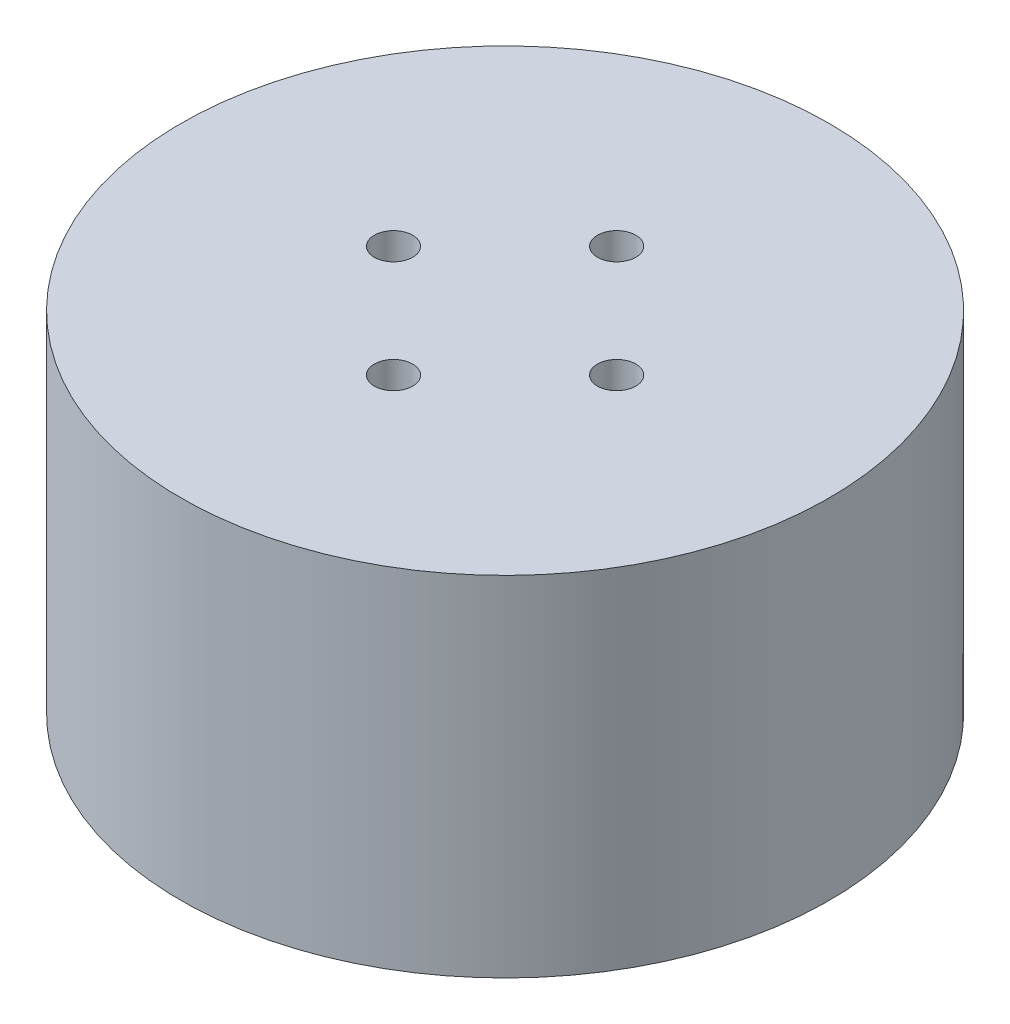
ISO-10303-21;
HEADER;
FILE_DESCRIPTION(('STEP AP214'),'2;1');
FILE_NAME('part.step','',(''),(''),'','','');
FILE_SCHEMA(('AUTOMOTIVE_DESIGN { 1 0 10303 214 1 1 1 1 }'));
ENDSEC;
DATA;
#1=APPLICATION_CONTEXT('core data for automotive mechanical design processes');
#2=APPLICATION_PROTOCOL_DEFINITION('international standard','automotive_design',2000,#1);
#3=PRODUCT_CONTEXT('',#1,'mechanical');
#4=PRODUCT('Part','Part','',(#3));
#5=PRODUCT_RELATED_PRODUCT_CATEGORY('part','',(#4));
#6=PRODUCT_DEFINITION_FORMATION('','',#4);
#7=PRODUCT_DEFINITION_CONTEXT('part definition',#1,'design');
#8=PRODUCT_DEFINITION('design','',#6,#7);
#9=PRODUCT_DEFINITION_SHAPE('','',#8);
#10=(LENGTH_UNIT() NAMED_UNIT(*) SI_UNIT(.MILLI.,.METRE.));
#11=(NAMED_UNIT(*) PLANE_ANGLE_UNIT() SI_UNIT($,.RADIAN.));
#12=(NAMED_UNIT(*) SI_UNIT($,.STERADIAN.) SOLID_ANGLE_UNIT());
#13=UNCERTAINTY_MEASURE_WITH_UNIT(LENGTH_MEASURE(1.E-05),#10,'distance_accuracy_value','');
#14=(GEOMETRIC_REPRESENTATION_CONTEXT(3) GLOBAL_UNCERTAINTY_ASSIGNED_CONTEXT((#13)) GLOBAL_UNIT_ASSIGNED_CONTEXT((#10,
#11,#12)) REPRESENTATION_CONTEXT('',''));
#15=CARTESIAN_POINT('',(0.,0.,0.));
#16=DIRECTION('',(0.,0.,1.));
#17=DIRECTION('',(1.,0.,0.));
#18=AXIS2_PLACEMENT_3D('',#15,#16,#17);
#19=CARTESIAN_POINT('',(0.,50.,0.));
#20=DIRECTION('',(0.,1.,0.));
#21=DIRECTION('',(0.,0.,1.));
#22=AXIS2_PLACEMENT_3D('',#19,#20,#21);
#23=PLANE('',#22);
#24=CARTESIAN_POINT('',(-16.,50.,0.));
#25=DIRECTION('',(0.,1.,0.));
#26=DIRECTION('',(0.,0.,1.));
#27=AXIS2_PLACEMENT_3D('',#24,#25,#26);
#28=CIRCLE('',#27,2.75);
#29=CARTESIAN_POINT('',(-16.,50.,2.75));
#30=VERTEX_POINT('',#29);
#31=EDGE_CURVE('E58',#30,#30,#28,.T.);
#32=ORIENTED_EDGE('',*,*,#31,.F.);
#33=EDGE_LOOP('',(#32));
#34=FACE_BOUND('',#33,.T.);
#35=CARTESIAN_POINT('',(0.,50.,16.));
#36=DIRECTION('',(0.,1.,0.));
#37=DIRECTION('',(0.,0.,1.));
#38=AXIS2_PLACEMENT_3D('',#35,#36,#37);
#39=CIRCLE('',#38,2.75);
#40=CARTESIAN_POINT('',(0.,50.,18.75));
#41=VERTEX_POINT('',#40);
#42=EDGE_CURVE('E75',#41,#41,#39,.T.);
#43=ORIENTED_EDGE('',*,*,#42,.F.);
#44=EDGE_LOOP('',(#43));
#45=FACE_BOUND('',#44,.T.);
#46=CARTESIAN_POINT('',(16.,50.,0.));
#47=DIRECTION('',(0.,1.,0.));
#48=DIRECTION('',(0.,0.,1.));
#49=AXIS2_PLACEMENT_3D('',#46,#47,#48);
#50=CIRCLE('',#49,2.75);
#51=CARTESIAN_POINT('',(16.,50.,2.75));
#52=VERTEX_POINT('',#51);
#53=EDGE_CURVE('E117',#52,#52,#50,.T.);
#54=ORIENTED_EDGE('',*,*,#53,.F.);
#55=EDGE_LOOP('',(#54));
#56=FACE_BOUND('',#55,.T.);
#57=CARTESIAN_POINT('',(0.,50.,-16.));
#58=DIRECTION('',(0.,1.,0.));
#59=DIRECTION('',(0.,0.,1.));
#60=AXIS2_PLACEMENT_3D('',#57,#58,#59);
#61=CIRCLE('',#60,2.75);
#62=CARTESIAN_POINT('',(0.,50.,-13.25));
#63=VERTEX_POINT('',#62);
#64=EDGE_CURVE('E62',#63,#63,#61,.T.);
#65=ORIENTED_EDGE('',*,*,#64,.F.);
#66=EDGE_LOOP('',(#65));
#67=FACE_BOUND('',#66,.T.);
#68=CARTESIAN_POINT('',(0.,50.,0.));
#69=DIRECTION('',(0.,-1.,0.));
#70=DIRECTION('',(0.,0.,-1.));
#71=AXIS2_PLACEMENT_3D('',#68,#69,#70);
#72=CIRCLE('',#71,46.5);
#73=CARTESIAN_POINT('',(0.,50.,-46.5));
#74=VERTEX_POINT('',#73);
#75=EDGE_CURVE('E123',#74,#74,#72,.T.);
#76=ORIENTED_EDGE('',*,*,#75,.F.);
#77=EDGE_LOOP('',(#76));
#78=FACE_BOUND('',#77,.T.);
#79=ADVANCED_FACE('F35',(#34,#45,#56,#67,#78),#23,.T.);
#80=CARTESIAN_POINT('',(0.,0.,0.));
#81=DIRECTION('',(0.,1.,0.));
#82=DIRECTION('',(0.,0.,1.));
#83=AXIS2_PLACEMENT_3D('',#80,#81,#82);
#84=PLANE('',#83);
#85=CARTESIAN_POINT('',(0.,0.,0.));
#86=DIRECTION('',(0.,-1.,0.));
#87=DIRECTION('',(0.,0.,-1.));
#88=AXIS2_PLACEMENT_3D('',#85,#86,#87);
#89=CIRCLE('',#88,26.);
#90=CARTESIAN_POINT('',(0.,0.,-26.));
#91=VERTEX_POINT('',#90);
#92=EDGE_CURVE('E43',#91,#91,#89,.T.);
#93=ORIENTED_EDGE('',*,*,#92,.F.);
#94=EDGE_LOOP('',(#93));
#95=FACE_BOUND('',#94,.T.);
#96=CARTESIAN_POINT('',(0.,0.,0.));
#97=DIRECTION('',(0.,-1.,0.));
#98=DIRECTION('',(0.,0.,-1.));
#99=AXIS2_PLACEMENT_3D('',#96,#97,#98);
#100=CIRCLE('',#99,46.5);
#101=CARTESIAN_POINT('',(0.,0.,-46.5));
#102=VERTEX_POINT('',#101);
#103=EDGE_CURVE('E125',#102,#102,#100,.T.);
#104=ORIENTED_EDGE('',*,*,#103,.T.);
#105=EDGE_LOOP('',(#104));
#106=FACE_BOUND('',#105,.T.);
#107=ADVANCED_FACE('F37',(#95,#106),#84,.F.);
#108=CARTESIAN_POINT('',(0.,20.,0.));
#109=DIRECTION('',(0.,-1.,0.));
#110=DIRECTION('',(0.,0.,-1.));
#111=AXIS2_PLACEMENT_3D('',#108,#109,#110);
#112=CYLINDRICAL_SURFACE('',#111,26.);
#113=CARTESIAN_POINT('',(0.,20.,0.));
#114=DIRECTION('',(0.,-1.,0.));
#115=DIRECTION('',(0.,0.,-1.));
#116=AXIS2_PLACEMENT_3D('',#113,#114,#115);
#117=CIRCLE('',#116,26.);
#118=CARTESIAN_POINT('',(0.,20.,-26.));
#119=VERTEX_POINT('',#118);
#120=EDGE_CURVE('E10',#119,#119,#117,.T.);
#121=ORIENTED_EDGE('',*,*,#120,.F.);
#122=EDGE_LOOP('',(#121));
#123=FACE_BOUND('',#122,.T.);
#124=ORIENTED_EDGE('',*,*,#92,.T.);
#125=EDGE_LOOP('',(#124));
#126=FACE_BOUND('',#125,.T.);
#127=ADVANCED_FACE('F91',(#123,#126),#112,.F.);
#128=CARTESIAN_POINT('',(0.,20.,0.));
#129=DIRECTION('',(0.,-1.,0.));
#130=DIRECTION('',(0.,0.,-1.));
#131=AXIS2_PLACEMENT_3D('',#128,#129,#130);
#132=PLANE('',#131);
#133=CARTESIAN_POINT('',(0.,20.,-16.));
#134=DIRECTION('',(0.,-1.,0.));
#135=DIRECTION('',(0.,0.,-1.));
#136=AXIS2_PLACEMENT_3D('',#133,#134,#135);
#137=CIRCLE('',#136,2.75);
#138=CARTESIAN_POINT('',(0.,20.,-18.75));
#139=VERTEX_POINT('',#138);
#140=EDGE_CURVE('E39',#139,#139,#137,.T.);
#141=ORIENTED_EDGE('',*,*,#140,.F.);
#142=EDGE_LOOP('',(#141));
#143=FACE_BOUND('',#142,.T.);
#144=CARTESIAN_POINT('',(16.,20.,0.));
#145=DIRECTION('',(0.,-1.,0.));
#146=DIRECTION('',(0.,0.,-1.));
#147=AXIS2_PLACEMENT_3D('',#144,#145,#146);
#148=CIRCLE('',#147,2.75);
#149=CARTESIAN_POINT('',(16.,20.,-2.75));
#150=VERTEX_POINT('',#149);
#151=EDGE_CURVE('E61',#150,#150,#148,.T.);
#152=ORIENTED_EDGE('',*,*,#151,.F.);
#153=EDGE_LOOP('',(#152));
#154=FACE_BOUND('',#153,.T.);
#155=CARTESIAN_POINT('',(0.,20.,16.));
#156=DIRECTION('',(0.,-1.,0.));
#157=DIRECTION('',(0.,0.,-1.));
#158=AXIS2_PLACEMENT_3D('',#155,#156,#157);
#159=CIRCLE('',#158,2.75);
#160=CARTESIAN_POINT('',(0.,20.,13.25));
#161=VERTEX_POINT('',#160);
#162=EDGE_CURVE('E59',#161,#161,#159,.T.);
#163=ORIENTED_EDGE('',*,*,#162,.F.);
#164=EDGE_LOOP('',(#163));
#165=FACE_BOUND('',#164,.T.);
#166=CARTESIAN_POINT('',(-16.,20.,0.));
#167=DIRECTION('',(0.,-1.,0.));
#168=DIRECTION('',(0.,0.,-1.));
#169=AXIS2_PLACEMENT_3D('',#166,#167,#168);
#170=CIRCLE('',#169,2.75);
#171=CARTESIAN_POINT('',(-16.,20.,-2.75));
#172=VERTEX_POINT('',#171);
#173=EDGE_CURVE('E54',#172,#172,#170,.T.);
#174=ORIENTED_EDGE('',*,*,#173,.F.);
#175=EDGE_LOOP('',(#174));
#176=FACE_BOUND('',#175,.T.);
#177=CARTESIAN_POINT('',(0.,20.,0.));
#178=DIRECTION('',(0.,-1.,0.));
#179=DIRECTION('',(0.,0.,-1.));
#180=AXIS2_PLACEMENT_3D('',#177,#178,#179);
#181=CIRCLE('',#180,11.);
#182=CARTESIAN_POINT('',(0.,20.,-11.));
#183=VERTEX_POINT('',#182);
#184=EDGE_CURVE('E51',#183,#183,#181,.T.);
#185=ORIENTED_EDGE('',*,*,#184,.F.);
#186=EDGE_LOOP('',(#185));
#187=FACE_BOUND('',#186,.T.);
#188=ORIENTED_EDGE('',*,*,#120,.T.);
#189=EDGE_LOOP('',(#188));
#190=FACE_BOUND('',#189,.T.);
#191=ADVANCED_FACE('F89',(#143,#154,#165,#176,#187,#190),#132,.T.);
#192=CARTESIAN_POINT('',(0.,27.5,0.));
#193=DIRECTION('',(0.,-1.,0.));
#194=DIRECTION('',(0.,0.,-1.));
#195=AXIS2_PLACEMENT_3D('',#192,#193,#194);
#196=CYLINDRICAL_SURFACE('',#195,11.);
#197=CARTESIAN_POINT('',(0.,27.5,0.));
#198=DIRECTION('',(0.,-1.,0.));
#199=DIRECTION('',(0.,0.,-1.));
#200=AXIS2_PLACEMENT_3D('',#197,#198,#199);
#201=CIRCLE('',#200,11.);
#202=CARTESIAN_POINT('',(0.,27.5,-11.));
#203=VERTEX_POINT('',#202);
#204=EDGE_CURVE('E48',#203,#203,#201,.T.);
#205=ORIENTED_EDGE('',*,*,#204,.F.);
#206=EDGE_LOOP('',(#205));
#207=FACE_BOUND('',#206,.T.);
#208=ORIENTED_EDGE('',*,*,#184,.T.);
#209=EDGE_LOOP('',(#208));
#210=FACE_BOUND('',#209,.T.);
#211=ADVANCED_FACE('F87',(#207,#210),#196,.F.);
#212=CARTESIAN_POINT('',(0.,27.5,0.));
#213=DIRECTION('',(0.,-1.,0.));
#214=DIRECTION('',(0.,0.,-1.));
#215=AXIS2_PLACEMENT_3D('',#212,#213,#214);
#216=PLANE('',#215);
#217=CARTESIAN_POINT('',(0.,27.5,0.));
#218=DIRECTION('',(0.,-1.,0.));
#219=DIRECTION('',(0.,0.,-1.));
#220=AXIS2_PLACEMENT_3D('',#217,#218,#219);
#221=CIRCLE('',#220,5.);
#222=CARTESIAN_POINT('',(0.,27.5,-5.));
#223=VERTEX_POINT('',#222);
#224=EDGE_CURVE('E57',#223,#223,#221,.T.);
#225=ORIENTED_EDGE('',*,*,#224,.F.);
#226=EDGE_LOOP('',(#225));
#227=FACE_BOUND('',#226,.T.);
#228=ORIENTED_EDGE('',*,*,#204,.T.);
#229=EDGE_LOOP('',(#228));
#230=FACE_BOUND('',#229,.T.);
#231=ADVANCED_FACE('F98',(#227,#230),#216,.T.);
#232=CARTESIAN_POINT('',(0.,41.,0.));
#233=DIRECTION('',(0.,-1.,0.));
#234=DIRECTION('',(0.,0.,-1.));
#235=AXIS2_PLACEMENT_3D('',#232,#233,#234);
#236=CYLINDRICAL_SURFACE('',#235,5.);
#237=CARTESIAN_POINT('',(0.,41.,0.));
#238=DIRECTION('',(0.,-1.,0.));
#239=DIRECTION('',(0.,0.,-1.));
#240=AXIS2_PLACEMENT_3D('',#237,#238,#239);
#241=CIRCLE('',#240,5.);
#242=CARTESIAN_POINT('',(0.,41.,-5.));
#243=VERTEX_POINT('',#242);
#244=EDGE_CURVE('E77',#243,#243,#241,.T.);
#245=ORIENTED_EDGE('',*,*,#244,.F.);
#246=EDGE_LOOP('',(#245));
#247=FACE_BOUND('',#246,.T.);
#248=ORIENTED_EDGE('',*,*,#224,.T.);
#249=EDGE_LOOP('',(#248));
#250=FACE_BOUND('',#249,.T.);
#251=ADVANCED_FACE('F153',(#247,#250),#236,.F.);
#252=CARTESIAN_POINT('',(0.,41.,0.));
#253=DIRECTION('',(0.,-1.,0.));
#254=DIRECTION('',(0.,0.,-1.));
#255=AXIS2_PLACEMENT_3D('',#252,#253,#254);
#256=PLANE('',#255);
#257=ORIENTED_EDGE('',*,*,#244,.T.);
#258=EDGE_LOOP('',(#257));
#259=FACE_BOUND('',#258,.T.);
#260=ADVANCED_FACE('F149',(#259),#256,.T.);
#261=CARTESIAN_POINT('',(-16.,0.,0.));
#262=DIRECTION('',(0.,1.,0.));
#263=DIRECTION('',(0.,0.,1.));
#264=AXIS2_PLACEMENT_3D('',#261,#262,#263);
#265=CYLINDRICAL_SURFACE('',#264,2.75);
#266=ORIENTED_EDGE('',*,*,#173,.T.);
#267=EDGE_LOOP('',(#266));
#268=FACE_BOUND('',#267,.T.);
#269=ORIENTED_EDGE('',*,*,#31,.T.);
#270=EDGE_LOOP('',(#269));
#271=FACE_BOUND('',#270,.T.);
#272=ADVANCED_FACE('F142',(#268,#271),#265,.F.);
#273=CARTESIAN_POINT('',(0.,0.,16.));
#274=DIRECTION('',(0.,1.,0.));
#275=DIRECTION('',(0.,0.,1.));
#276=AXIS2_PLACEMENT_3D('',#273,#274,#275);
#277=CYLINDRICAL_SURFACE('',#276,2.75);
#278=ORIENTED_EDGE('',*,*,#162,.T.);
#279=EDGE_LOOP('',(#278));
#280=FACE_BOUND('',#279,.T.);
#281=ORIENTED_EDGE('',*,*,#42,.T.);
#282=EDGE_LOOP('',(#281));
#283=FACE_BOUND('',#282,.T.);
#284=ADVANCED_FACE('F134',(#280,#283),#277,.F.);
#285=CARTESIAN_POINT('',(16.,0.,0.));
#286=DIRECTION('',(0.,1.,0.));
#287=DIRECTION('',(0.,0.,1.));
#288=AXIS2_PLACEMENT_3D('',#285,#286,#287);
#289=CYLINDRICAL_SURFACE('',#288,2.75);
#290=ORIENTED_EDGE('',*,*,#151,.T.);
#291=EDGE_LOOP('',(#290));
#292=FACE_BOUND('',#291,.T.);
#293=ORIENTED_EDGE('',*,*,#53,.T.);
#294=EDGE_LOOP('',(#293));
#295=FACE_BOUND('',#294,.T.);
#296=ADVANCED_FACE('F131',(#292,#295),#289,.F.);
#297=CARTESIAN_POINT('',(0.,0.,-16.));
#298=DIRECTION('',(0.,1.,0.));
#299=DIRECTION('',(0.,0.,1.));
#300=AXIS2_PLACEMENT_3D('',#297,#298,#299);
#301=CYLINDRICAL_SURFACE('',#300,2.75);
#302=ORIENTED_EDGE('',*,*,#140,.T.);
#303=EDGE_LOOP('',(#302));
#304=FACE_BOUND('',#303,.T.);
#305=ORIENTED_EDGE('',*,*,#64,.T.);
#306=EDGE_LOOP('',(#305));
#307=FACE_BOUND('',#306,.T.);
#308=ADVANCED_FACE('F133',(#304,#307),#301,.F.);
#309=CARTESIAN_POINT('',(0.,50.,0.));
#310=DIRECTION('',(0.,-1.,0.));
#311=DIRECTION('',(0.,0.,-1.));
#312=AXIS2_PLACEMENT_3D('',#309,#310,#311);
#313=CYLINDRICAL_SURFACE('',#312,46.5);
#314=ORIENTED_EDGE('',*,*,#75,.T.);
#315=EDGE_LOOP('',(#314));
#316=FACE_BOUND('',#315,.T.);
#317=ORIENTED_EDGE('',*,*,#103,.F.);
#318=EDGE_LOOP('',(#317));
#319=FACE_BOUND('',#318,.T.);
#320=ADVANCED_FACE('F140',(#316,#319),#313,.T.);
#321=CLOSED_SHELL('',(#79,#107,#127,#191,#211,#231,#251,#260,#272,#284,#296,#308,#320));
#322=MANIFOLD_SOLID_BREP('B2',#321);
#323=ADVANCED_BREP_SHAPE_REPRESENTATION('',(#18,#322),#14);
#324=SHAPE_DEFINITION_REPRESENTATION(#9,#323);
ENDSEC;
END-ISO-10303-21;
